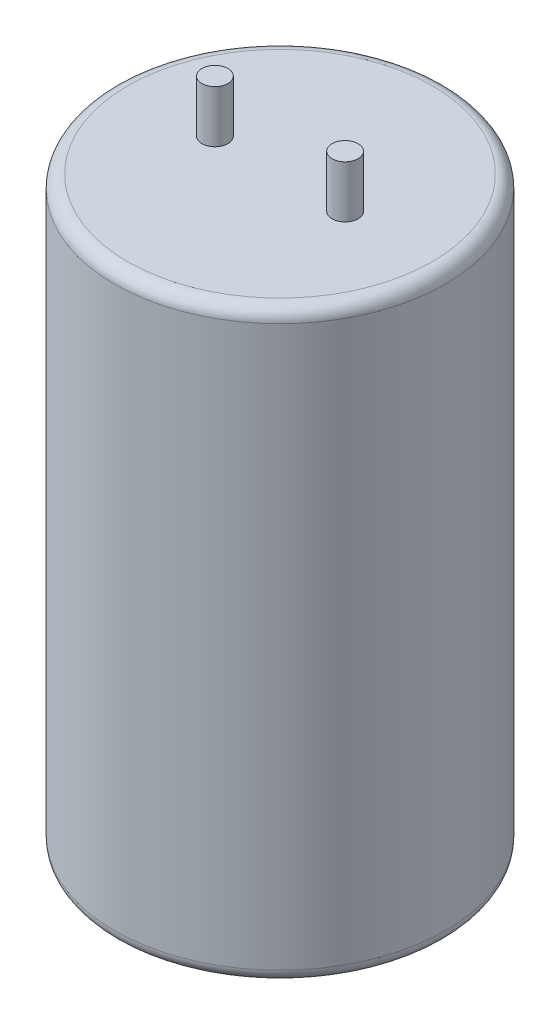
ISO-10303-21;
HEADER;
FILE_DESCRIPTION(('STEP AP214'),'2;1');
FILE_NAME('part.step','',(''),(''),'','','');
FILE_SCHEMA(('AUTOMOTIVE_DESIGN { 1 0 10303 214 1 1 1 1 }'));
ENDSEC;
DATA;
#1=APPLICATION_CONTEXT('core data for automotive mechanical design processes');
#2=APPLICATION_PROTOCOL_DEFINITION('international standard','automotive_design',2000,#1);
#3=PRODUCT_CONTEXT('',#1,'mechanical');
#4=PRODUCT('Part','Part','',(#3));
#5=PRODUCT_RELATED_PRODUCT_CATEGORY('part','',(#4));
#6=PRODUCT_DEFINITION_FORMATION('','',#4);
#7=PRODUCT_DEFINITION_CONTEXT('part definition',#1,'design');
#8=PRODUCT_DEFINITION('design','',#6,#7);
#9=PRODUCT_DEFINITION_SHAPE('','',#8);
#10=(LENGTH_UNIT() NAMED_UNIT(*) SI_UNIT(.MILLI.,.METRE.));
#11=(NAMED_UNIT(*) PLANE_ANGLE_UNIT() SI_UNIT($,.RADIAN.));
#12=(NAMED_UNIT(*) SI_UNIT($,.STERADIAN.) SOLID_ANGLE_UNIT());
#13=UNCERTAINTY_MEASURE_WITH_UNIT(LENGTH_MEASURE(1.E-05),#10,'distance_accuracy_value','');
#14=(GEOMETRIC_REPRESENTATION_CONTEXT(3) GLOBAL_UNCERTAINTY_ASSIGNED_CONTEXT((#13)) GLOBAL_UNIT_ASSIGNED_CONTEXT((#10,
#11,#12)) REPRESENTATION_CONTEXT('',''));
#15=CARTESIAN_POINT('',(0.,0.,0.));
#16=DIRECTION('',(0.,0.,1.));
#17=DIRECTION('',(1.,0.,0.));
#18=AXIS2_PLACEMENT_3D('',#15,#16,#17);
#19=CARTESIAN_POINT('',(0.,45.,0.));
#20=DIRECTION('',(0.,-1.,0.));
#21=DIRECTION('',(0.,0.,-1.));
#22=AXIS2_PLACEMENT_3D('',#19,#20,#21);
#23=CYLINDRICAL_SURFACE('',#22,12.7);
#24=CARTESIAN_POINT('',(0.,1.,0.));
#25=DIRECTION('',(0.,1.,0.));
#26=DIRECTION('',(0.,0.,1.));
#27=AXIS2_PLACEMENT_3D('',#24,#25,#26);
#28=CIRCLE('',#27,12.7);
#29=CARTESIAN_POINT('',(0.,0.999999999999994,-12.7));
#30=VERTEX_POINT('',#29);
#31=EDGE_CURVE('E45',#30,#30,#28,.T.);
#32=CARTESIAN_POINT('',(0.,44.,0.));
#33=DIRECTION('',(0.,1.,0.));
#34=DIRECTION('',(0.,0.,1.));
#35=AXIS2_PLACEMENT_3D('',#32,#33,#34);
#36=CIRCLE('',#35,12.7);
#37=CARTESIAN_POINT('',(0.,44.,-12.7));
#38=VERTEX_POINT('',#37);
#39=EDGE_CURVE('E49',#38,#38,#36,.F.);
#40=CARTESIAN_POINT('',(0.,0.999999999999994,-12.7));
#41=CARTESIAN_POINT('',(0.,1.44791666666666,-12.7));
#42=CARTESIAN_POINT('',(0.,1.89583333333333,-12.7));
#43=CARTESIAN_POINT('',(0.,2.79166666666666,-12.7));
#44=CARTESIAN_POINT('',(0.,3.23958333333333,-12.7));
#45=CARTESIAN_POINT('',(0.,4.13541666666666,-12.7));
#46=CARTESIAN_POINT('',(0.,4.58333333333333,-12.7));
#47=CARTESIAN_POINT('',(0.,5.47916666666666,-12.7));
#48=CARTESIAN_POINT('',(0.,5.92708333333333,-12.7));
#49=CARTESIAN_POINT('',(0.,6.82291666666666,-12.7));
#50=CARTESIAN_POINT('',(0.,7.27083333333333,-12.7));
#51=CARTESIAN_POINT('',(0.,8.16666666666666,-12.7));
#52=CARTESIAN_POINT('',(0.,8.61458333333333,-12.7));
#53=CARTESIAN_POINT('',(0.,9.51041666666666,-12.7));
#54=CARTESIAN_POINT('',(0.,9.95833333333333,-12.7));
#55=CARTESIAN_POINT('',(0.,10.8541666666667,-12.7));
#56=CARTESIAN_POINT('',(0.,11.3020833333333,-12.7));
#57=CARTESIAN_POINT('',(0.,12.1979166666667,-12.7));
#58=CARTESIAN_POINT('',(0.,12.6458333333333,-12.7));
#59=CARTESIAN_POINT('',(0.,13.5416666666667,-12.7));
#60=CARTESIAN_POINT('',(0.,13.9895833333333,-12.7));
#61=CARTESIAN_POINT('',(0.,14.8854166666667,-12.7));
#62=CARTESIAN_POINT('',(0.,15.3333333333333,-12.7));
#63=CARTESIAN_POINT('',(0.,16.2291666666667,-12.7));
#64=CARTESIAN_POINT('',(0.,16.6770833333333,-12.7));
#65=CARTESIAN_POINT('',(0.,17.5729166666667,-12.7));
#66=CARTESIAN_POINT('',(0.,18.0208333333333,-12.7));
#67=CARTESIAN_POINT('',(0.,18.9166666666667,-12.7));
#68=CARTESIAN_POINT('',(0.,19.3645833333333,-12.7));
#69=CARTESIAN_POINT('',(0.,20.2604166666667,-12.7));
#70=CARTESIAN_POINT('',(0.,20.7083333333333,-12.7));
#71=CARTESIAN_POINT('',(0.,21.6041666666667,-12.7));
#72=CARTESIAN_POINT('',(0.,22.0520833333333,-12.7));
#73=CARTESIAN_POINT('',(0.,22.9479166666667,-12.7));
#74=CARTESIAN_POINT('',(0.,23.3958333333333,-12.7));
#75=CARTESIAN_POINT('',(0.,24.2916666666667,-12.7));
#76=CARTESIAN_POINT('',(0.,24.7395833333333,-12.7));
#77=CARTESIAN_POINT('',(0.,25.6354166666667,-12.7));
#78=CARTESIAN_POINT('',(0.,26.0833333333333,-12.7));
#79=CARTESIAN_POINT('',(0.,26.9791666666667,-12.7));
#80=CARTESIAN_POINT('',(0.,27.4270833333333,-12.7));
#81=CARTESIAN_POINT('',(0.,28.3229166666667,-12.7));
#82=CARTESIAN_POINT('',(0.,28.7708333333333,-12.7));
#83=CARTESIAN_POINT('',(0.,29.6666666666667,-12.7));
#84=CARTESIAN_POINT('',(0.,30.1145833333333,-12.7));
#85=CARTESIAN_POINT('',(0.,31.0104166666667,-12.7));
#86=CARTESIAN_POINT('',(0.,31.4583333333333,-12.7));
#87=CARTESIAN_POINT('',(0.,32.3541666666667,-12.7));
#88=CARTESIAN_POINT('',(0.,32.8020833333333,-12.7));
#89=CARTESIAN_POINT('',(0.,33.6979166666667,-12.7));
#90=CARTESIAN_POINT('',(0.,34.1458333333333,-12.7));
#91=CARTESIAN_POINT('',(0.,35.0416666666667,-12.7));
#92=CARTESIAN_POINT('',(0.,35.4895833333333,-12.7));
#93=CARTESIAN_POINT('',(0.,36.3854166666667,-12.7));
#94=CARTESIAN_POINT('',(0.,36.8333333333333,-12.7));
#95=CARTESIAN_POINT('',(0.,37.7291666666667,-12.7));
#96=CARTESIAN_POINT('',(0.,38.1770833333333,-12.7));
#97=CARTESIAN_POINT('',(0.,39.0729166666667,-12.7));
#98=CARTESIAN_POINT('',(0.,39.5208333333333,-12.7));
#99=CARTESIAN_POINT('',(0.,40.4166666666667,-12.7));
#100=CARTESIAN_POINT('',(0.,40.8645833333333,-12.7));
#101=CARTESIAN_POINT('',(0.,41.7604166666667,-12.7));
#102=CARTESIAN_POINT('',(0.,42.2083333333333,-12.7));
#103=CARTESIAN_POINT('',(0.,43.1041666666667,-12.7));
#104=CARTESIAN_POINT('',(0.,43.5520833333333,-12.7));
#105=CARTESIAN_POINT('',(0.,44.,-12.7));
#106=B_SPLINE_CURVE_WITH_KNOTS('',3,(#40,#41,#42,#43,#44,#45,#46,#47,#48,#49,#50,#51,#52,#53,
#54,#55,#56,#57,#58,#59,#60,#61,#62,#63,#64,#65,#66,#67,#68,#69,#70,#71,#72,#73,#74,#75,#76,#77,
#78,#79,#80,#81,#82,#83,#84,#85,#86,#87,#88,#89,#90,#91,#92,#93,#94,#95,#96,#97,#98,#99,#100,
#101,#102,#103,#104,#105),.UNSPECIFIED.,.F.,.F.,(4,2,2,2,2,2,2,2,2,2,2,2,2,2,2,2,2,2,2,2,2,2,2,
2,2,2,2,2,2,2,2,2,4),(0.,1.34375,2.6875,4.03125,5.375,6.71875,8.0625,9.40625000000001,10.75,
12.09375,13.4375,14.78125,16.125,17.46875,18.8125,20.15625,21.5,22.84375,24.1875,25.53125,
26.875,28.21875,29.5625,30.90625,32.25,33.59375,34.9375,36.28125,37.625,38.96875,40.3125,
41.65625,43.),.UNSPECIFIED.);
#107=EDGE_CURVE('BSEAM34',#30,#38,#106,.T.);
#108=ORIENTED_EDGE('',*,*,#31,.T.);
#109=ORIENTED_EDGE('',*,*,#39,.T.);
#110=ORIENTED_EDGE('',*,*,#107,.T.);
#111=ORIENTED_EDGE('',*,*,#107,.F.);
#112=EDGE_LOOP('',(#108,#110,#109,#111));
#113=FACE_BOUND('',#112,.T.);
#114=ADVANCED_FACE('F34',(#113),#23,.T.);
#115=CARTESIAN_POINT('',(0.,45.,0.));
#116=DIRECTION('',(0.,1.,0.));
#117=DIRECTION('',(0.,0.,1.));
#118=AXIS2_PLACEMENT_3D('',#115,#116,#117);
#119=PLANE('',#118);
#120=CARTESIAN_POINT('',(-5.,45.,0.));
#121=DIRECTION('',(0.,1.,0.));
#122=DIRECTION('',(0.,0.,1.));
#123=AXIS2_PLACEMENT_3D('',#120,#121,#122);
#124=CIRCLE('',#123,1.);
#125=CARTESIAN_POINT('',(-5.,45.,1.));
#126=VERTEX_POINT('',#125);
#127=EDGE_CURVE('E61',#126,#126,#124,.T.);
#128=ORIENTED_EDGE('',*,*,#127,.F.);
#129=EDGE_LOOP('',(#128));
#130=FACE_BOUND('',#129,.T.);
#131=CARTESIAN_POINT('',(5.,45.,0.));
#132=DIRECTION('',(0.,1.,0.));
#133=DIRECTION('',(0.,0.,1.));
#134=AXIS2_PLACEMENT_3D('',#131,#132,#133);
#135=CIRCLE('',#134,1.);
#136=CARTESIAN_POINT('',(5.,45.,1.));
#137=VERTEX_POINT('',#136);
#138=EDGE_CURVE('E55',#137,#137,#135,.T.);
#139=ORIENTED_EDGE('',*,*,#138,.F.);
#140=EDGE_LOOP('',(#139));
#141=FACE_BOUND('',#140,.T.);
#142=CARTESIAN_POINT('',(0.,45.,0.));
#143=DIRECTION('',(0.,1.,0.));
#144=DIRECTION('',(0.,0.,1.));
#145=AXIS2_PLACEMENT_3D('',#142,#143,#144);
#146=CIRCLE('',#145,11.7);
#147=CARTESIAN_POINT('',(0.,45.,11.7));
#148=VERTEX_POINT('',#147);
#149=EDGE_CURVE('E10',#148,#148,#146,.T.);
#150=ORIENTED_EDGE('',*,*,#149,.T.);
#151=EDGE_LOOP('',(#150));
#152=FACE_BOUND('',#151,.T.);
#153=ADVANCED_FACE('F76',(#130,#141,#152),#119,.T.);
#154=CARTESIAN_POINT('',(0.,0.,0.));
#155=DIRECTION('',(0.,1.,0.));
#156=DIRECTION('',(0.,0.,1.));
#157=AXIS2_PLACEMENT_3D('',#154,#155,#156);
#158=PLANE('',#157);
#159=CARTESIAN_POINT('',(0.,0.,0.));
#160=DIRECTION('',(0.,1.,0.));
#161=DIRECTION('',(0.,0.,1.));
#162=AXIS2_PLACEMENT_3D('',#159,#160,#161);
#163=CIRCLE('',#162,11.7);
#164=CARTESIAN_POINT('',(0.,0.,11.7));
#165=VERTEX_POINT('',#164);
#166=EDGE_CURVE('E41',#165,#165,#163,.F.);
#167=ORIENTED_EDGE('',*,*,#166,.T.);
#168=EDGE_LOOP('',(#167));
#169=FACE_BOUND('',#168,.T.);
#170=ADVANCED_FACE('F79',(#169),#158,.F.);
#171=CARTESIAN_POINT('',(0.,1.,0.));
#172=DIRECTION('',(0.,1.,0.));
#173=DIRECTION('',(0.,0.,1.));
#174=AXIS2_PLACEMENT_3D('',#171,#172,#173);
#175=TOROIDAL_SURFACE('',#174,11.7,1.);
#176=ORIENTED_EDGE('',*,*,#166,.F.);
#177=EDGE_LOOP('',(#176));
#178=FACE_BOUND('',#177,.T.);
#179=ORIENTED_EDGE('',*,*,#31,.F.);
#180=EDGE_LOOP('',(#179));
#181=FACE_BOUND('',#180,.T.);
#182=ADVANCED_FACE('F93',(#178,#181),#175,.T.);
#183=CARTESIAN_POINT('',(0.,44.,0.));
#184=DIRECTION('',(0.,1.,0.));
#185=DIRECTION('',(0.,0.,1.));
#186=AXIS2_PLACEMENT_3D('',#183,#184,#185);
#187=TOROIDAL_SURFACE('',#186,11.7,1.);
#188=ORIENTED_EDGE('',*,*,#39,.F.);
#189=EDGE_LOOP('',(#188));
#190=FACE_BOUND('',#189,.T.);
#191=ORIENTED_EDGE('',*,*,#149,.F.);
#192=EDGE_LOOP('',(#191));
#193=FACE_BOUND('',#192,.T.);
#194=ADVANCED_FACE('F36',(#190,#193),#187,.T.);
#195=CARTESIAN_POINT('',(5.,49.,0.));
#196=DIRECTION('',(0.,-1.,0.));
#197=DIRECTION('',(0.,0.,-1.));
#198=AXIS2_PLACEMENT_3D('',#195,#196,#197);
#199=CYLINDRICAL_SURFACE('',#198,1.);
#200=CARTESIAN_POINT('',(5.,49.,0.));
#201=DIRECTION('',(0.,1.,0.));
#202=DIRECTION('',(0.,0.,1.));
#203=AXIS2_PLACEMENT_3D('',#200,#201,#202);
#204=CIRCLE('',#203,1.);
#205=CARTESIAN_POINT('',(5.,49.,1.));
#206=VERTEX_POINT('',#205);
#207=EDGE_CURVE('E54',#206,#206,#204,.T.);
#208=ORIENTED_EDGE('',*,*,#207,.F.);
#209=EDGE_LOOP('',(#208));
#210=FACE_BOUND('',#209,.T.);
#211=ORIENTED_EDGE('',*,*,#138,.T.);
#212=EDGE_LOOP('',(#211));
#213=FACE_BOUND('',#212,.T.);
#214=ADVANCED_FACE('F83',(#210,#213),#199,.T.);
#215=CARTESIAN_POINT('',(5.,49.,0.));
#216=DIRECTION('',(0.,1.,0.));
#217=DIRECTION('',(0.,0.,1.));
#218=AXIS2_PLACEMENT_3D('',#215,#216,#217);
#219=PLANE('',#218);
#220=ORIENTED_EDGE('',*,*,#207,.T.);
#221=EDGE_LOOP('',(#220));
#222=FACE_BOUND('',#221,.T.);
#223=ADVANCED_FACE('F72',(#222),#219,.T.);
#224=CARTESIAN_POINT('',(-5.,49.,0.));
#225=DIRECTION('',(0.,-1.,0.));
#226=DIRECTION('',(0.,0.,-1.));
#227=AXIS2_PLACEMENT_3D('',#224,#225,#226);
#228=CYLINDRICAL_SURFACE('',#227,1.);
#229=CARTESIAN_POINT('',(-5.,49.,0.));
#230=DIRECTION('',(0.,1.,0.));
#231=DIRECTION('',(0.,0.,1.));
#232=AXIS2_PLACEMENT_3D('',#229,#230,#231);
#233=CIRCLE('',#232,1.);
#234=CARTESIAN_POINT('',(-5.,49.,1.));
#235=VERTEX_POINT('',#234);
#236=EDGE_CURVE('E58',#235,#235,#233,.T.);
#237=ORIENTED_EDGE('',*,*,#236,.F.);
#238=EDGE_LOOP('',(#237));
#239=FACE_BOUND('',#238,.T.);
#240=ORIENTED_EDGE('',*,*,#127,.T.);
#241=EDGE_LOOP('',(#240));
#242=FACE_BOUND('',#241,.T.);
#243=ADVANCED_FACE('F69',(#239,#242),#228,.T.);
#244=CARTESIAN_POINT('',(-5.,49.,0.));
#245=DIRECTION('',(0.,1.,0.));
#246=DIRECTION('',(0.,0.,1.));
#247=AXIS2_PLACEMENT_3D('',#244,#245,#246);
#248=PLANE('',#247);
#249=ORIENTED_EDGE('',*,*,#236,.T.);
#250=EDGE_LOOP('',(#249));
#251=FACE_BOUND('',#250,.T.);
#252=ADVANCED_FACE('F67',(#251),#248,.T.);
#253=CLOSED_SHELL('',(#114,#153,#170,#182,#194,#214,#223,#243,#252));
#254=MANIFOLD_SOLID_BREP('B2',#253);
#255=ADVANCED_BREP_SHAPE_REPRESENTATION('',(#18,#254),#14);
#256=SHAPE_DEFINITION_REPRESENTATION(#9,#255);
ENDSEC;
END-ISO-10303-21;
